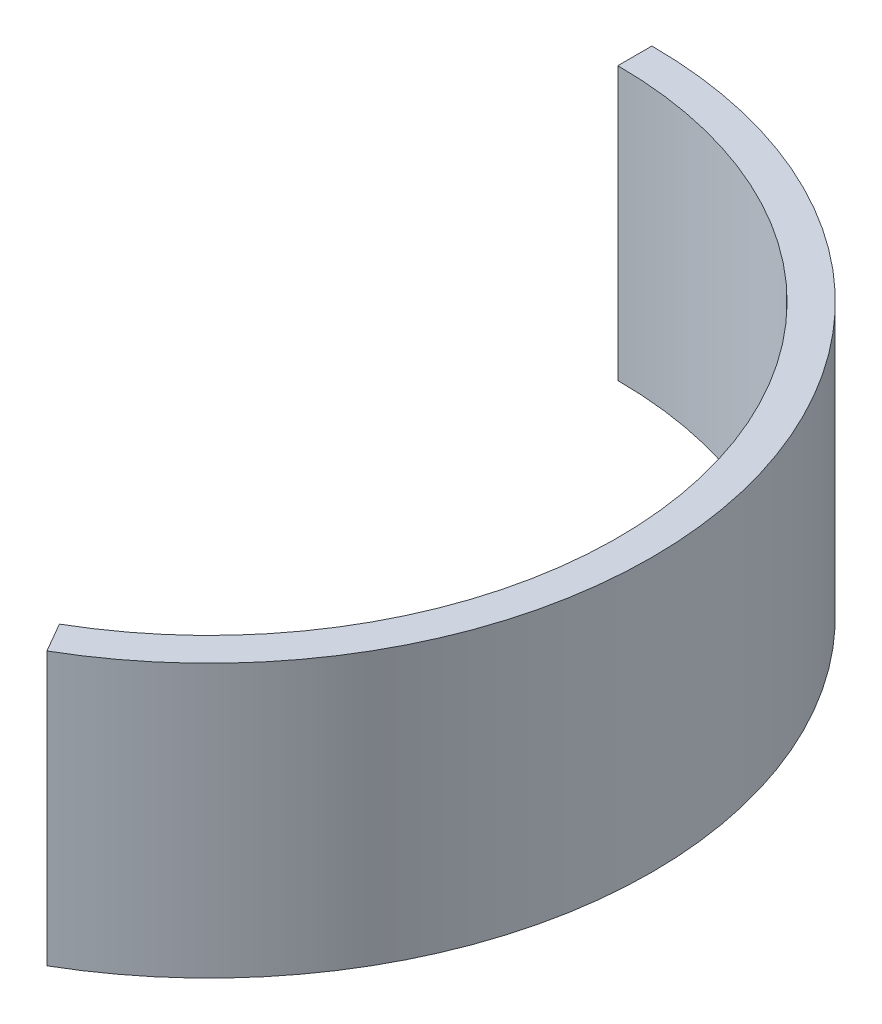
ISO-10303-21;
HEADER;
FILE_DESCRIPTION(('STEP AP214'),'2;1');
FILE_NAME('part.step','',(''),(''),'','','');
FILE_SCHEMA(('AUTOMOTIVE_DESIGN { 1 0 10303 214 1 1 1 1 }'));
ENDSEC;
DATA;
#1=APPLICATION_CONTEXT('core data for automotive mechanical design processes');
#2=APPLICATION_PROTOCOL_DEFINITION('international standard','automotive_design',2000,#1);
#3=PRODUCT_CONTEXT('',#1,'mechanical');
#4=PRODUCT('Part','Part','',(#3));
#5=PRODUCT_RELATED_PRODUCT_CATEGORY('part','',(#4));
#6=PRODUCT_DEFINITION_FORMATION('','',#4);
#7=PRODUCT_DEFINITION_CONTEXT('part definition',#1,'design');
#8=PRODUCT_DEFINITION('design','',#6,#7);
#9=PRODUCT_DEFINITION_SHAPE('','',#8);
#10=(LENGTH_UNIT() NAMED_UNIT(*) SI_UNIT(.MILLI.,.METRE.));
#11=(NAMED_UNIT(*) PLANE_ANGLE_UNIT() SI_UNIT($,.RADIAN.));
#12=(NAMED_UNIT(*) SI_UNIT($,.STERADIAN.) SOLID_ANGLE_UNIT());
#13=UNCERTAINTY_MEASURE_WITH_UNIT(LENGTH_MEASURE(1.E-05),#10,'distance_accuracy_value','');
#14=(GEOMETRIC_REPRESENTATION_CONTEXT(3) GLOBAL_UNCERTAINTY_ASSIGNED_CONTEXT((#13)) GLOBAL_UNIT_ASSIGNED_CONTEXT((#10,
#11,#12)) REPRESENTATION_CONTEXT('',''));
#15=CARTESIAN_POINT('',(0.,0.,0.));
#16=DIRECTION('',(0.,0.,1.));
#17=DIRECTION('',(1.,0.,0.));
#18=AXIS2_PLACEMENT_3D('',#15,#16,#17);
#19=CARTESIAN_POINT('',(0.,25.4,38.07714));
#20=DIRECTION('',(0.,-1.,0.));
#21=DIRECTION('',(0.,0.,-1.));
#22=AXIS2_PLACEMENT_3D('',#19,#20,#21);
#23=CYLINDRICAL_SURFACE('',#22,38.07714);
#24=CARTESIAN_POINT('',(0.,0.,38.07714));
#25=DIRECTION('',(0.,-1.,0.));
#26=DIRECTION('',(0.,0.,-1.));
#27=AXIS2_PLACEMENT_3D('',#24,#25,#26);
#28=CIRCLE('',#27,38.07714);
#29=CARTESIAN_POINT('',(0.,0.,0.));
#30=VERTEX_POINT('',#29);
#31=CARTESIAN_POINT('',(19.0385699999998,0.,71.0529105434567));
#32=VERTEX_POINT('',#31);
#33=EDGE_CURVE('E107',#30,#32,#28,.T.);
#34=ORIENTED_EDGE('',*,*,#33,.T.);
#35=DIRECTION('',(0.,-1.,0.));
#36=VECTOR('',#35,1.);
#37=CARTESIAN_POINT('',(19.0385699999998,25.4,71.0529105434567));
#38=LINE('',#37,#36);
#39=CARTESIAN_POINT('',(19.0385699999998,25.4,71.0529105434567));
#40=VERTEX_POINT('',#39);
#41=EDGE_CURVE('E11',#40,#32,#38,.T.);
#42=ORIENTED_EDGE('',*,*,#41,.F.);
#43=CARTESIAN_POINT('',(0.,25.4,38.07714));
#44=DIRECTION('',(0.,-1.,0.));
#45=DIRECTION('',(0.,0.,-1.));
#46=AXIS2_PLACEMENT_3D('',#43,#44,#45);
#47=CIRCLE('',#46,38.07714);
#48=CARTESIAN_POINT('',(0.,25.4,0.));
#49=VERTEX_POINT('',#48);
#50=EDGE_CURVE('E91',#49,#40,#47,.T.);
#51=ORIENTED_EDGE('',*,*,#50,.F.);
#52=DIRECTION('',(0.,-1.,0.));
#53=VECTOR('',#52,1.);
#54=CARTESIAN_POINT('',(0.,25.4,0.));
#55=LINE('',#54,#53);
#56=EDGE_CURVE('E103',#49,#30,#55,.T.);
#57=ORIENTED_EDGE('',*,*,#56,.T.);
#58=EDGE_LOOP('',(#34,#42,#51,#57));
#59=FACE_BOUND('',#58,.T.);
#60=ADVANCED_FACE('F39',(#59),#23,.F.);
#61=CARTESIAN_POINT('',(19.0385699999998,25.4,71.0529105434567));
#62=DIRECTION('',(0.866025403784442,0.,-0.499999999999995));
#63=DIRECTION('',(-0.499999999999995,0.,-0.866025403784442));
#64=AXIS2_PLACEMENT_3D('',#61,#62,#63);
#65=PLANE('',#64);
#66=DIRECTION('',(0.499999999999995,0.,0.866025403784441));
#67=VECTOR('',#66,1.);
#68=CARTESIAN_POINT('',(19.0385699999998,0.,71.0529105434567));
#69=LINE('',#68,#67);
#70=CARTESIAN_POINT('',(20.6260699999998,0.,73.8025412004723));
#71=VERTEX_POINT('',#70);
#72=EDGE_CURVE('E96',#32,#71,#69,.T.);
#73=ORIENTED_EDGE('',*,*,#72,.T.);
#74=DIRECTION('',(0.,-1.,0.));
#75=VECTOR('',#74,1.);
#76=CARTESIAN_POINT('',(20.6260699999998,25.4,73.8025412004723));
#77=LINE('',#76,#75);
#78=CARTESIAN_POINT('',(20.6260699999998,25.4,73.8025412004723));
#79=VERTEX_POINT('',#78);
#80=EDGE_CURVE('E48',#79,#71,#77,.T.);
#81=ORIENTED_EDGE('',*,*,#80,.F.);
#82=DIRECTION('',(0.499999999999995,0.,0.866025403784441));
#83=VECTOR('',#82,1.);
#84=CARTESIAN_POINT('',(19.0385699999998,25.4,71.0529105434567));
#85=LINE('',#84,#83);
#86=EDGE_CURVE('E86',#40,#79,#85,.T.);
#87=ORIENTED_EDGE('',*,*,#86,.F.);
#88=ORIENTED_EDGE('',*,*,#41,.T.);
#89=EDGE_LOOP('',(#73,#81,#87,#88));
#90=FACE_BOUND('',#89,.T.);
#91=ADVANCED_FACE('F95',(#90),#65,.F.);
#92=CARTESIAN_POINT('',(0.,25.4,38.07714));
#93=DIRECTION('',(0.,-1.,0.));
#94=DIRECTION('',(0.,0.,-1.));
#95=AXIS2_PLACEMENT_3D('',#92,#93,#94);
#96=CYLINDRICAL_SURFACE('',#95,41.25214);
#97=CARTESIAN_POINT('',(0.,0.,38.07714));
#98=DIRECTION('',(0.,1.,0.));
#99=DIRECTION('',(0.,0.,-1.));
#100=AXIS2_PLACEMENT_3D('',#97,#98,#99);
#101=CIRCLE('',#100,41.25214);
#102=CARTESIAN_POINT('',(0.,0.,-3.175));
#103=VERTEX_POINT('',#102);
#104=EDGE_CURVE('E73',#71,#103,#101,.T.);
#105=ORIENTED_EDGE('',*,*,#104,.T.);
#106=DIRECTION('',(0.,-1.,0.));
#107=VECTOR('',#106,1.);
#108=CARTESIAN_POINT('',(0.,25.4,-3.175));
#109=LINE('',#108,#107);
#110=CARTESIAN_POINT('',(0.,25.4,-3.175));
#111=VERTEX_POINT('',#110);
#112=EDGE_CURVE('E98',#111,#103,#109,.T.);
#113=ORIENTED_EDGE('',*,*,#112,.F.);
#114=CARTESIAN_POINT('',(0.,25.4,38.07714));
#115=DIRECTION('',(0.,1.,0.));
#116=DIRECTION('',(0.,0.,-1.));
#117=AXIS2_PLACEMENT_3D('',#114,#115,#116);
#118=CIRCLE('',#117,41.25214);
#119=EDGE_CURVE('E89',#79,#111,#118,.T.);
#120=ORIENTED_EDGE('',*,*,#119,.F.);
#121=ORIENTED_EDGE('',*,*,#80,.T.);
#122=EDGE_LOOP('',(#105,#113,#120,#121));
#123=FACE_BOUND('',#122,.T.);
#124=ADVANCED_FACE('F99',(#123),#96,.T.);
#125=CARTESIAN_POINT('',(0.,25.4,0.));
#126=DIRECTION('',(1.,0.,0.));
#127=DIRECTION('',(0.,0.,-1.));
#128=AXIS2_PLACEMENT_3D('',#125,#126,#127);
#129=PLANE('',#128);
#130=DIRECTION('',(0.,0.,1.));
#131=VECTOR('',#130,1.);
#132=CARTESIAN_POINT('',(0.,0.,0.));
#133=LINE('',#132,#131);
#134=EDGE_CURVE('E79',#103,#30,#133,.T.);
#135=ORIENTED_EDGE('',*,*,#134,.T.);
#136=ORIENTED_EDGE('',*,*,#56,.F.);
#137=DIRECTION('',(0.,0.,1.));
#138=VECTOR('',#137,1.);
#139=CARTESIAN_POINT('',(0.,25.4,0.));
#140=LINE('',#139,#138);
#141=EDGE_CURVE('E56',#111,#49,#140,.T.);
#142=ORIENTED_EDGE('',*,*,#141,.F.);
#143=ORIENTED_EDGE('',*,*,#112,.T.);
#144=EDGE_LOOP('',(#135,#136,#142,#143));
#145=FACE_BOUND('',#144,.T.);
#146=ADVANCED_FACE('F120',(#145),#129,.F.);
#147=CARTESIAN_POINT('',(0.,25.4,38.07714));
#148=DIRECTION('',(0.,-1.,0.));
#149=DIRECTION('',(0.,0.,-1.));
#150=AXIS2_PLACEMENT_3D('',#147,#148,#149);
#151=PLANE('',#150);
#152=ORIENTED_EDGE('',*,*,#50,.T.);
#153=ORIENTED_EDGE('',*,*,#86,.T.);
#154=ORIENTED_EDGE('',*,*,#119,.T.);
#155=ORIENTED_EDGE('',*,*,#141,.T.);
#156=EDGE_LOOP('',(#152,#153,#154,#155));
#157=FACE_BOUND('',#156,.T.);
#158=ADVANCED_FACE('F87',(#157),#151,.F.);
#159=CARTESIAN_POINT('',(0.,0.,38.07714));
#160=DIRECTION('',(0.,-1.,0.));
#161=DIRECTION('',(0.,0.,-1.));
#162=AXIS2_PLACEMENT_3D('',#159,#160,#161);
#163=PLANE('',#162);
#164=ORIENTED_EDGE('',*,*,#33,.F.);
#165=ORIENTED_EDGE('',*,*,#134,.F.);
#166=ORIENTED_EDGE('',*,*,#104,.F.);
#167=ORIENTED_EDGE('',*,*,#72,.F.);
#168=EDGE_LOOP('',(#164,#165,#166,#167));
#169=FACE_BOUND('',#168,.T.);
#170=ADVANCED_FACE('F123',(#169),#163,.T.);
#171=CLOSED_SHELL('',(#60,#91,#124,#146,#158,#170));
#172=MANIFOLD_SOLID_BREP('B2',#171);
#173=ADVANCED_BREP_SHAPE_REPRESENTATION('',(#18,#172),#14);
#174=SHAPE_DEFINITION_REPRESENTATION(#9,#173);
ENDSEC;
END-ISO-10303-21;
